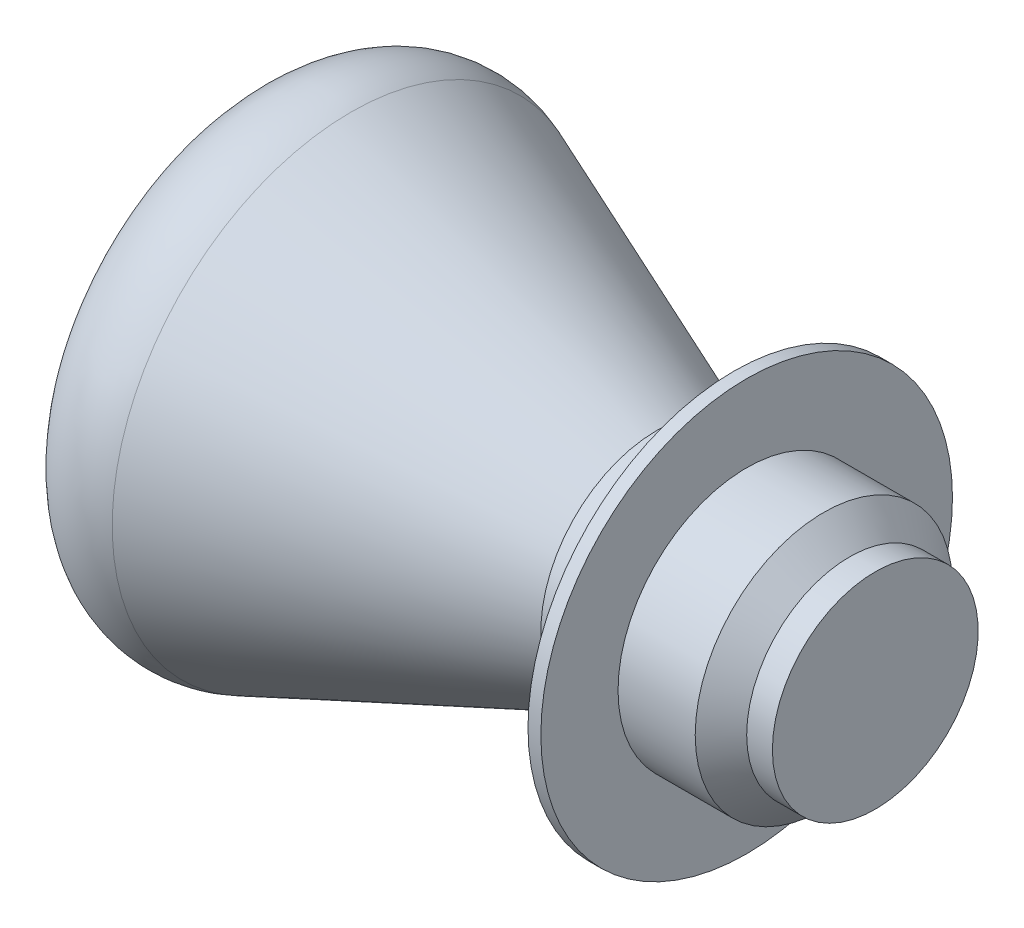
ISO-10303-21;
HEADER;
FILE_DESCRIPTION(('STEP AP214'),'2;1');
FILE_NAME('part.step','',(''),(''),'','','');
FILE_SCHEMA(('AUTOMOTIVE_DESIGN { 1 0 10303 214 1 1 1 1 }'));
ENDSEC;
DATA;
#1=APPLICATION_CONTEXT('core data for automotive mechanical design processes');
#2=APPLICATION_PROTOCOL_DEFINITION('international standard','automotive_design',2000,#1);
#3=PRODUCT_CONTEXT('',#1,'mechanical');
#4=PRODUCT('Part','Part','',(#3));
#5=PRODUCT_RELATED_PRODUCT_CATEGORY('part','',(#4));
#6=PRODUCT_DEFINITION_FORMATION('','',#4);
#7=PRODUCT_DEFINITION_CONTEXT('part definition',#1,'design');
#8=PRODUCT_DEFINITION('design','',#6,#7);
#9=PRODUCT_DEFINITION_SHAPE('','',#8);
#10=(LENGTH_UNIT() NAMED_UNIT(*) SI_UNIT(.MILLI.,.METRE.));
#11=(NAMED_UNIT(*) PLANE_ANGLE_UNIT() SI_UNIT($,.RADIAN.));
#12=(NAMED_UNIT(*) SI_UNIT($,.STERADIAN.) SOLID_ANGLE_UNIT());
#13=UNCERTAINTY_MEASURE_WITH_UNIT(LENGTH_MEASURE(1.E-05),#10,'distance_accuracy_value','');
#14=(GEOMETRIC_REPRESENTATION_CONTEXT(3) GLOBAL_UNCERTAINTY_ASSIGNED_CONTEXT((#13)) GLOBAL_UNIT_ASSIGNED_CONTEXT((#10,
#11,#12)) REPRESENTATION_CONTEXT('',''));
#15=CARTESIAN_POINT('',(0.,0.,0.));
#16=DIRECTION('',(0.,0.,1.));
#17=DIRECTION('',(1.,0.,0.));
#18=AXIS2_PLACEMENT_3D('',#15,#16,#17);
#19=CARTESIAN_POINT('',(0.,0.,0.));
#20=DIRECTION('',(-1.,0.,0.));
#21=DIRECTION('',(0.,-1.,0.));
#22=AXIS2_PLACEMENT_3D('',#19,#20,#21);
#23=PLANE('',#22);
#24=CARTESIAN_POINT('',(0.,0.,0.));
#25=DIRECTION('',(-1.,0.,0.));
#26=DIRECTION('',(0.,-1.,0.));
#27=AXIS2_PLACEMENT_3D('',#24,#25,#26);
#28=CIRCLE('',#27,4.5);
#29=CARTESIAN_POINT('',(0.,-4.5,0.));
#30=VERTEX_POINT('',#29);
#31=EDGE_CURVE('E11',#30,#30,#28,.T.);
#32=ORIENTED_EDGE('',*,*,#31,.F.);
#33=EDGE_LOOP('',(#32));
#34=FACE_BOUND('',#33,.T.);
#35=ADVANCED_FACE('F39',(#34),#23,.F.);
#36=CARTESIAN_POINT('',(-19.8583623383361,0.,0.));
#37=DIRECTION('',(-1.,0.,0.));
#38=DIRECTION('',(0.,-1.,0.));
#39=AXIS2_PLACEMENT_3D('',#36,#37,#38);
#40=CYLINDRICAL_SURFACE('',#39,4.5);
#41=CARTESIAN_POINT('',(-3.,0.,0.));
#42=DIRECTION('',(-1.,0.,0.));
#43=DIRECTION('',(0.,-1.,0.));
#44=AXIS2_PLACEMENT_3D('',#41,#42,#43);
#45=CIRCLE('',#44,4.5);
#46=CARTESIAN_POINT('',(-3.,-4.5,0.));
#47=VERTEX_POINT('',#46);
#48=EDGE_CURVE('E45',#47,#47,#45,.T.);
#49=ORIENTED_EDGE('',*,*,#48,.F.);
#50=EDGE_LOOP('',(#49));
#51=FACE_BOUND('',#50,.T.);
#52=ORIENTED_EDGE('',*,*,#31,.T.);
#53=EDGE_LOOP('',(#52));
#54=FACE_BOUND('',#53,.T.);
#55=ADVANCED_FACE('F69',(#51,#54),#40,.T.);
#56=CARTESIAN_POINT('',(-3.,0.,0.));
#57=DIRECTION('',(-1.,0.,0.));
#58=DIRECTION('',(0.,-1.,0.));
#59=AXIS2_PLACEMENT_3D('',#56,#57,#58);
#60=CONICAL_SURFACE('',#59,4.5,0.382760510475255);
#61=CARTESIAN_POINT('',(-14.8795520760162,0.,0.));
#62=DIRECTION('',(-1.,0.,0.));
#63=DIRECTION('',(0.,-1.,0.));
#64=AXIS2_PLACEMENT_3D('',#61,#62,#63);
#65=CIRCLE('',#64,9.28291150589458);
#66=CARTESIAN_POINT('',(-14.8795520760162,-9.28291150589458,0.));
#67=VERTEX_POINT('',#66);
#68=EDGE_CURVE('E49',#67,#67,#65,.T.);
#69=ORIENTED_EDGE('',*,*,#68,.F.);
#70=EDGE_LOOP('',(#69));
#71=FACE_BOUND('',#70,.T.);
#72=ORIENTED_EDGE('',*,*,#48,.T.);
#73=EDGE_LOOP('',(#72));
#74=FACE_BOUND('',#73,.T.);
#75=ADVANCED_FACE('F64',(#71,#74),#60,.T.);
#76=CARTESIAN_POINT('',(-16.,0.,0.));
#77=DIRECTION('',(-1.,0.,0.));
#78=DIRECTION('',(0.,-1.,0.));
#79=AXIS2_PLACEMENT_3D('',#76,#77,#78);
#80=TOROIDAL_SURFACE('',#79,6.5,3.);
#81=CARTESIAN_POINT('',(-18.8971610617009,0.,0.));
#82=DIRECTION('',(-1.,0.,0.));
#83=DIRECTION('',(0.,-1.,0.));
#84=AXIS2_PLACEMENT_3D('',#81,#82,#83);
#85=CIRCLE('',#84,7.27875399361023);
#86=CARTESIAN_POINT('',(-18.8971610617009,-7.27875399361023,0.));
#87=VERTEX_POINT('',#86);
#88=EDGE_CURVE('E53',#87,#87,#85,.T.);
#89=ORIENTED_EDGE('',*,*,#88,.F.);
#90=EDGE_LOOP('',(#89));
#91=FACE_BOUND('',#90,.T.);
#92=ORIENTED_EDGE('',*,*,#68,.T.);
#93=EDGE_LOOP('',(#92));
#94=FACE_BOUND('',#93,.T.);
#95=ADVANCED_FACE('F61',(#91,#94),#80,.T.);
#96=CARTESIAN_POINT('',(8.18163766166386,0.,0.));
#97=DIRECTION('',(-1.,0.,0.));
#98=DIRECTION('',(0.,1.,0.));
#99=AXIS2_PLACEMENT_3D('',#96,#97,#98);
#100=SPHERICAL_SURFACE('',#99,28.04);
#101=ORIENTED_EDGE('',*,*,#88,.T.);
#102=EDGE_LOOP('',(#101));
#103=FACE_BOUND('',#102,.T.);
#104=ADVANCED_FACE('F59',(#103),#100,.T.);
#105=CLOSED_SHELL('',(#35,#55,#75,#95,#104));
#106=MANIFOLD_SOLID_BREP('B2',#105);
#107=CARTESIAN_POINT('',(0.,4.5,0.));
#108=DIRECTION('',(1.,0.,0.));
#109=DIRECTION('',(0.,0.,-1.));
#110=AXIS2_PLACEMENT_3D('',#107,#108,#109);
#111=PLANE('',#110);
#112=CARTESIAN_POINT('',(0.,0.,0.));
#113=DIRECTION('',(-1.,0.,0.));
#114=DIRECTION('',(0.,0.,1.));
#115=AXIS2_PLACEMENT_3D('',#112,#113,#114);
#116=CIRCLE('',#115,4.5);
#117=CARTESIAN_POINT('',(0.,0.,4.5));
#118=VERTEX_POINT('',#117);
#119=EDGE_CURVE('E144',#118,#118,#116,.T.);
#120=ORIENTED_EDGE('',*,*,#119,.T.);
#121=EDGE_LOOP('',(#120));
#122=FACE_BOUND('',#121,.T.);
#123=ADVANCED_FACE('F110',(#122),#111,.F.);
#124=CARTESIAN_POINT('',(5.5,0.,0.));
#125=DIRECTION('',(-1.,0.,0.));
#126=DIRECTION('',(0.,0.,1.));
#127=AXIS2_PLACEMENT_3D('',#124,#125,#126);
#128=PLANE('',#127);
#129=CARTESIAN_POINT('',(5.5,0.,0.));
#130=DIRECTION('',(-1.,0.,0.));
#131=DIRECTION('',(0.,0.,1.));
#132=AXIS2_PLACEMENT_3D('',#129,#130,#131);
#133=CIRCLE('',#132,4.);
#134=CARTESIAN_POINT('',(5.5,0.,4.));
#135=VERTEX_POINT('',#134);
#136=EDGE_CURVE('E38',#135,#135,#133,.T.);
#137=ORIENTED_EDGE('',*,*,#136,.F.);
#138=EDGE_LOOP('',(#137));
#139=FACE_BOUND('',#138,.T.);
#140=ADVANCED_FACE('F198',(#139),#128,.F.);
#141=CARTESIAN_POINT('',(0.,0.,0.));
#142=DIRECTION('',(-1.,0.,0.));
#143=DIRECTION('',(0.,0.,1.));
#144=AXIS2_PLACEMENT_3D('',#141,#142,#143);
#145=CYLINDRICAL_SURFACE('',#144,4.);
#146=CARTESIAN_POINT('',(4.5,0.,0.));
#147=DIRECTION('',(-1.,0.,0.));
#148=DIRECTION('',(0.,0.,1.));
#149=AXIS2_PLACEMENT_3D('',#146,#147,#148);
#150=CIRCLE('',#149,4.);
#151=CARTESIAN_POINT('',(4.5,0.,4.));
#152=VERTEX_POINT('',#151);
#153=EDGE_CURVE('E116',#152,#152,#150,.T.);
#154=ORIENTED_EDGE('',*,*,#153,.F.);
#155=EDGE_LOOP('',(#154));
#156=FACE_BOUND('',#155,.T.);
#157=ORIENTED_EDGE('',*,*,#136,.T.);
#158=EDGE_LOOP('',(#157));
#159=FACE_BOUND('',#158,.T.);
#160=ADVANCED_FACE('F193',(#156,#159),#145,.T.);
#161=CARTESIAN_POINT('',(4.5,0.,0.));
#162=DIRECTION('',(-1.,0.,0.));
#163=DIRECTION('',(0.,0.,1.));
#164=AXIS2_PLACEMENT_3D('',#161,#162,#163);
#165=CONICAL_SURFACE('',#164,4.,0.785398163397448);
#166=CARTESIAN_POINT('',(3.5,0.,0.));
#167=DIRECTION('',(-1.,0.,0.));
#168=DIRECTION('',(0.,0.,1.));
#169=AXIS2_PLACEMENT_3D('',#166,#167,#168);
#170=CIRCLE('',#169,5.);
#171=CARTESIAN_POINT('',(3.5,0.,5.));
#172=VERTEX_POINT('',#171);
#173=EDGE_CURVE('E120',#172,#172,#170,.T.);
#174=ORIENTED_EDGE('',*,*,#173,.F.);
#175=EDGE_LOOP('',(#174));
#176=FACE_BOUND('',#175,.T.);
#177=ORIENTED_EDGE('',*,*,#153,.T.);
#178=EDGE_LOOP('',(#177));
#179=FACE_BOUND('',#178,.T.);
#180=ADVANCED_FACE('F188',(#176,#179),#165,.T.);
#181=CARTESIAN_POINT('',(0.,0.,0.));
#182=DIRECTION('',(-1.,0.,0.));
#183=DIRECTION('',(0.,0.,1.));
#184=AXIS2_PLACEMENT_3D('',#181,#182,#183);
#185=CYLINDRICAL_SURFACE('',#184,5.);
#186=CARTESIAN_POINT('',(0.499999999999999,0.,0.));
#187=DIRECTION('',(-1.,0.,0.));
#188=DIRECTION('',(0.,0.,1.));
#189=AXIS2_PLACEMENT_3D('',#186,#187,#188);
#190=CIRCLE('',#189,5.);
#191=CARTESIAN_POINT('',(0.499999999999999,0.,5.));
#192=VERTEX_POINT('',#191);
#193=EDGE_CURVE('E124',#192,#192,#190,.T.);
#194=ORIENTED_EDGE('',*,*,#193,.F.);
#195=EDGE_LOOP('',(#194));
#196=FACE_BOUND('',#195,.T.);
#197=ORIENTED_EDGE('',*,*,#173,.T.);
#198=EDGE_LOOP('',(#197));
#199=FACE_BOUND('',#198,.T.);
#200=ADVANCED_FACE('F182',(#196,#199),#185,.T.);
#201=CARTESIAN_POINT('',(0.499999999999999,8.,0.));
#202=DIRECTION('',(-1.,0.,0.));
#203=DIRECTION('',(0.,0.,1.));
#204=AXIS2_PLACEMENT_3D('',#201,#202,#203);
#205=PLANE('',#204);
#206=CARTESIAN_POINT('',(0.499999999999999,0.,0.));
#207=DIRECTION('',(-1.,0.,0.));
#208=DIRECTION('',(0.,0.,1.));
#209=AXIS2_PLACEMENT_3D('',#206,#207,#208);
#210=CIRCLE('',#209,8.);
#211=CARTESIAN_POINT('',(0.499999999999999,0.,8.));
#212=VERTEX_POINT('',#211);
#213=EDGE_CURVE('E129',#212,#212,#210,.T.);
#214=ORIENTED_EDGE('',*,*,#213,.F.);
#215=EDGE_LOOP('',(#214));
#216=FACE_BOUND('',#215,.T.);
#217=ORIENTED_EDGE('',*,*,#193,.T.);
#218=EDGE_LOOP('',(#217));
#219=FACE_BOUND('',#218,.T.);
#220=ADVANCED_FACE('F176',(#216,#219),#205,.F.);
#221=CARTESIAN_POINT('',(0.,0.,0.));
#222=DIRECTION('',(-1.,0.,0.));
#223=DIRECTION('',(0.,0.,1.));
#224=AXIS2_PLACEMENT_3D('',#221,#222,#223);
#225=CYLINDRICAL_SURFACE('',#224,8.);
#226=CARTESIAN_POINT('',(0.,0.,0.));
#227=DIRECTION('',(-1.,0.,0.));
#228=DIRECTION('',(0.,0.,1.));
#229=AXIS2_PLACEMENT_3D('',#226,#227,#228);
#230=CIRCLE('',#229,8.);
#231=CARTESIAN_POINT('',(0.,0.,8.));
#232=VERTEX_POINT('',#231);
#233=EDGE_CURVE('E132',#232,#232,#230,.T.);
#234=ORIENTED_EDGE('',*,*,#233,.F.);
#235=EDGE_LOOP('',(#234));
#236=FACE_BOUND('',#235,.T.);
#237=ORIENTED_EDGE('',*,*,#213,.T.);
#238=EDGE_LOOP('',(#237));
#239=FACE_BOUND('',#238,.T.);
#240=ADVANCED_FACE('F170',(#236,#239),#225,.T.);
#241=CARTESIAN_POINT('',(0.,5.,0.));
#242=DIRECTION('',(1.,0.,0.));
#243=DIRECTION('',(0.,0.,-1.));
#244=AXIS2_PLACEMENT_3D('',#241,#242,#243);
#245=PLANE('',#244);
#246=CARTESIAN_POINT('',(0.,0.,0.));
#247=DIRECTION('',(-1.,0.,0.));
#248=DIRECTION('',(0.,0.,1.));
#249=AXIS2_PLACEMENT_3D('',#246,#247,#248);
#250=CIRCLE('',#249,5.);
#251=CARTESIAN_POINT('',(0.,0.,5.));
#252=VERTEX_POINT('',#251);
#253=EDGE_CURVE('E135',#252,#252,#250,.T.);
#254=ORIENTED_EDGE('',*,*,#253,.F.);
#255=EDGE_LOOP('',(#254));
#256=FACE_BOUND('',#255,.T.);
#257=ORIENTED_EDGE('',*,*,#233,.T.);
#258=EDGE_LOOP('',(#257));
#259=FACE_BOUND('',#258,.T.);
#260=ADVANCED_FACE('F164',(#256,#259),#245,.F.);
#261=CARTESIAN_POINT('',(0.,0.,0.));
#262=DIRECTION('',(-1.,0.,0.));
#263=DIRECTION('',(0.,0.,1.));
#264=AXIS2_PLACEMENT_3D('',#261,#262,#263);
#265=CYLINDRICAL_SURFACE('',#264,5.);
#266=CARTESIAN_POINT('',(-2.,0.,0.));
#267=DIRECTION('',(-1.,0.,0.));
#268=DIRECTION('',(0.,0.,1.));
#269=AXIS2_PLACEMENT_3D('',#266,#267,#268);
#270=CIRCLE('',#269,5.);
#271=CARTESIAN_POINT('',(-2.,0.,5.));
#272=VERTEX_POINT('',#271);
#273=EDGE_CURVE('E138',#272,#272,#270,.T.);
#274=ORIENTED_EDGE('',*,*,#273,.F.);
#275=EDGE_LOOP('',(#274));
#276=FACE_BOUND('',#275,.T.);
#277=ORIENTED_EDGE('',*,*,#253,.T.);
#278=EDGE_LOOP('',(#277));
#279=FACE_BOUND('',#278,.T.);
#280=ADVANCED_FACE('F158',(#276,#279),#265,.T.);
#281=CARTESIAN_POINT('',(-2.,5.,0.));
#282=DIRECTION('',(1.,0.,0.));
#283=DIRECTION('',(0.,0.,-1.));
#284=AXIS2_PLACEMENT_3D('',#281,#282,#283);
#285=PLANE('',#284);
#286=CARTESIAN_POINT('',(-2.,0.,0.));
#287=DIRECTION('',(-1.,0.,0.));
#288=DIRECTION('',(0.,0.,1.));
#289=AXIS2_PLACEMENT_3D('',#286,#287,#288);
#290=CIRCLE('',#289,4.5);
#291=CARTESIAN_POINT('',(-2.,0.,4.5));
#292=VERTEX_POINT('',#291);
#293=EDGE_CURVE('E141',#292,#292,#290,.T.);
#294=ORIENTED_EDGE('',*,*,#293,.F.);
#295=EDGE_LOOP('',(#294));
#296=FACE_BOUND('',#295,.T.);
#297=ORIENTED_EDGE('',*,*,#273,.T.);
#298=EDGE_LOOP('',(#297));
#299=FACE_BOUND('',#298,.T.);
#300=ADVANCED_FACE('F152',(#296,#299),#285,.F.);
#301=CARTESIAN_POINT('',(0.,0.,0.));
#302=DIRECTION('',(-1.,0.,0.));
#303=DIRECTION('',(0.,0.,1.));
#304=AXIS2_PLACEMENT_3D('',#301,#302,#303);
#305=CYLINDRICAL_SURFACE('',#304,4.5);
#306=ORIENTED_EDGE('',*,*,#119,.F.);
#307=EDGE_LOOP('',(#306));
#308=FACE_BOUND('',#307,.T.);
#309=ORIENTED_EDGE('',*,*,#293,.T.);
#310=EDGE_LOOP('',(#309));
#311=FACE_BOUND('',#310,.T.);
#312=ADVANCED_FACE('F149',(#308,#311),#305,.F.);
#313=CLOSED_SHELL('',(#123,#140,#160,#180,#200,#220,#240,#260,#280,#300,#312));
#314=MANIFOLD_SOLID_BREP('B6',#313);
#315=ADVANCED_BREP_SHAPE_REPRESENTATION('',(#18,#106,#314),#14);
#316=SHAPE_DEFINITION_REPRESENTATION(#9,#315);
ENDSEC;
END-ISO-10303-21;
